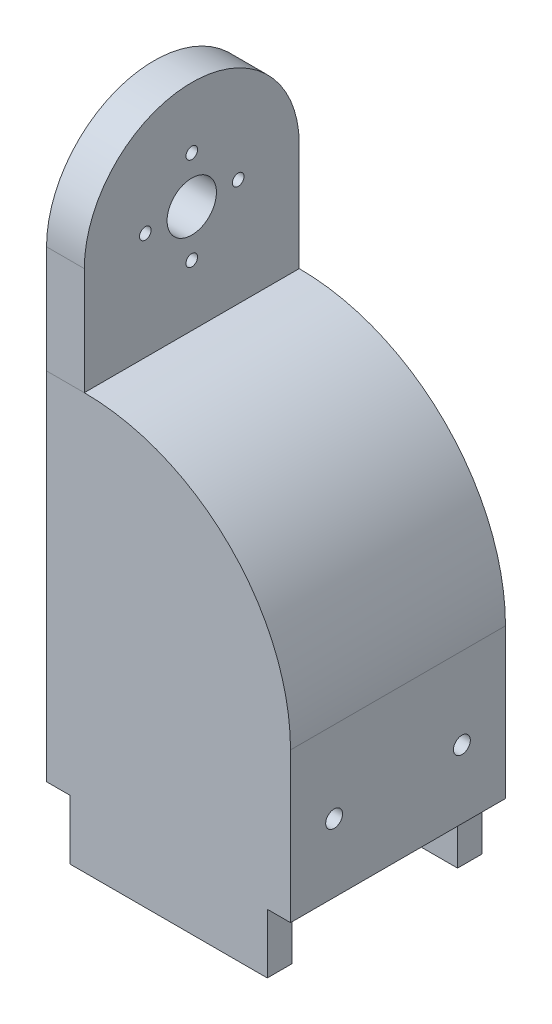
ISO-10303-21;
HEADER;
FILE_DESCRIPTION(('STEP AP214'),'2;1');
FILE_NAME('part.step','',(''),(''),'','','');
FILE_SCHEMA(('AUTOMOTIVE_DESIGN { 1 0 10303 214 1 1 1 1 }'));
ENDSEC;
DATA;
#1=APPLICATION_CONTEXT('core data for automotive mechanical design processes');
#2=APPLICATION_PROTOCOL_DEFINITION('international standard','automotive_design',2000,#1);
#3=PRODUCT_CONTEXT('',#1,'mechanical');
#4=PRODUCT('Part','Part','',(#3));
#5=PRODUCT_RELATED_PRODUCT_CATEGORY('part','',(#4));
#6=PRODUCT_DEFINITION_FORMATION('','',#4);
#7=PRODUCT_DEFINITION_CONTEXT('part definition',#1,'design');
#8=PRODUCT_DEFINITION('design','',#6,#7);
#9=PRODUCT_DEFINITION_SHAPE('','',#8);
#10=(LENGTH_UNIT() NAMED_UNIT(*) SI_UNIT(.MILLI.,.METRE.));
#11=(NAMED_UNIT(*) PLANE_ANGLE_UNIT() SI_UNIT($,.RADIAN.));
#12=(NAMED_UNIT(*) SI_UNIT($,.STERADIAN.) SOLID_ANGLE_UNIT());
#13=UNCERTAINTY_MEASURE_WITH_UNIT(LENGTH_MEASURE(1.E-05),#10,'distance_accuracy_value','');
#14=(GEOMETRIC_REPRESENTATION_CONTEXT(3) GLOBAL_UNCERTAINTY_ASSIGNED_CONTEXT((#13)) GLOBAL_UNIT_ASSIGNED_CONTEXT((#10,
#11,#12)) REPRESENTATION_CONTEXT('',''));
#15=CARTESIAN_POINT('',(0.,0.,0.));
#16=DIRECTION('',(0.,0.,1.));
#17=DIRECTION('',(1.,0.,0.));
#18=AXIS2_PLACEMENT_3D('',#15,#16,#17);
#19=CARTESIAN_POINT('',(7.77916234626263,147.70603748985,27.6424805889509));
#20=DIRECTION('',(1.,0.,0.));
#21=DIRECTION('',(0.,1.,0.));
#22=AXIS2_PLACEMENT_3D('',#19,#20,#21);
#23=PLANE('',#22);
#24=DIRECTION('',(0.,0.,1.));
#25=VECTOR('',#24,1.);
#26=CARTESIAN_POINT('',(7.77916234626261,2.95603748984996,27.6424805889509));
#27=LINE('',#26,#25);
#28=CARTESIAN_POINT('',(7.77916234626259,2.95603748984996,40.8924805889509));
#29=VERTEX_POINT('',#28);
#30=CARTESIAN_POINT('',(7.77916234626261,2.95603748984996,69.3924805889509));
#31=VERTEX_POINT('',#30);
#32=EDGE_CURVE('P0_E345',#29,#31,#27,.T.);
#33=ORIENTED_EDGE('',*,*,#32,.T.);
#34=DIRECTION('',(0.,1.,0.));
#35=VECTOR('',#34,1.);
#36=CARTESIAN_POINT('',(7.77916234626261,-22.0439625101501,69.3924805889509));
#37=LINE('',#36,#35);
#38=CARTESIAN_POINT('',(7.77916234626259,-12.0439625101501,69.3924805889509));
#39=VERTEX_POINT('',#38);
#40=EDGE_CURVE('P0_E351',#39,#31,#37,.T.);
#41=ORIENTED_EDGE('',*,*,#40,.F.);
#42=DIRECTION('',(0.,0.,1.));
#43=VECTOR('',#42,1.);
#44=CARTESIAN_POINT('',(7.77916234626259,-12.0439625101501,27.6424805889509));
#45=LINE('',#44,#43);
#46=CARTESIAN_POINT('',(7.77916234626259,-12.0439625101501,40.8924805889509));
#47=VERTEX_POINT('',#46);
#48=EDGE_CURVE('P0_E205',#47,#39,#45,.T.);
#49=ORIENTED_EDGE('',*,*,#48,.F.);
#50=DIRECTION('',(0.,1.,0.));
#51=VECTOR('',#50,1.);
#52=CARTESIAN_POINT('',(7.77916234626261,-22.0439625101501,40.8924805889509));
#53=LINE('',#52,#51);
#54=EDGE_CURVE('P0_E330',#47,#29,#53,.T.);
#55=ORIENTED_EDGE('',*,*,#54,.T.);
#56=EDGE_LOOP('',(#33,#41,#49,#55));
#57=FACE_BOUND('',#56,.T.);
#58=CARTESIAN_POINT('',(7.7791623462626,-0.293962510150042,66.1424805889509));
#59=DIRECTION('',(1.,0.,0.));
#60=DIRECTION('',(0.,0.,-1.));
#61=AXIS2_PLACEMENT_3D('',#58,#59,#60);
#62=CIRCLE('',#61,1.45);
#63=CARTESIAN_POINT('',(7.7791623462626,-0.293962510150042,64.6924805889509));
#64=VERTEX_POINT('',#63);
#65=EDGE_CURVE('P0_E289',#64,#64,#62,.T.);
#66=ORIENTED_EDGE('',*,*,#65,.F.);
#67=EDGE_LOOP('',(#66));
#68=FACE_BOUND('',#67,.T.);
#69=CARTESIAN_POINT('',(7.7791623462626,-0.293962510150042,44.1424805889509));
#70=DIRECTION('',(1.,0.,0.));
#71=DIRECTION('',(0.,0.,-1.));
#72=AXIS2_PLACEMENT_3D('',#69,#70,#71);
#73=CIRCLE('',#72,1.45);
#74=CARTESIAN_POINT('',(7.7791623462626,-0.293962510150042,42.6924805889509));
#75=VERTEX_POINT('',#74);
#76=EDGE_CURVE('P0_E296',#75,#75,#73,.T.);
#77=ORIENTED_EDGE('',*,*,#76,.F.);
#78=EDGE_LOOP('',(#77));
#79=FACE_BOUND('',#78,.T.);
#80=ADVANCED_FACE('P0_F45',(#57,#68,#79),#23,.T.);
#81=CARTESIAN_POINT('',(24.7791623462626,2.95603748984996,27.6424805889509));
#82=DIRECTION('',(0.,1.,0.));
#83=DIRECTION('',(0.,0.,1.));
#84=AXIS2_PLACEMENT_3D('',#81,#82,#83);
#85=PLANE('',#84);
#86=DIRECTION('',(-1.,0.,0.));
#87=VECTOR('',#86,1.);
#88=CARTESIAN_POINT('',(7.77916234626261,2.95603748984996,40.8924805889509));
#89=LINE('',#88,#87);
#90=CARTESIAN_POINT('',(41.7791623462626,2.95603748984996,40.8924805889509));
#91=VERTEX_POINT('',#90);
#92=EDGE_CURVE('P0_E196',#91,#29,#89,.T.);
#93=ORIENTED_EDGE('',*,*,#92,.F.);
#94=DIRECTION('',(0.,0.,1.));
#95=VECTOR('',#94,1.);
#96=CARTESIAN_POINT('',(41.7791623462626,2.95603748984996,27.6424805889509));
#97=LINE('',#96,#95);
#98=CARTESIAN_POINT('',(41.7791623462626,2.95603748984996,69.3924805889509));
#99=VERTEX_POINT('',#98);
#100=EDGE_CURVE('P0_E183',#91,#99,#97,.T.);
#101=ORIENTED_EDGE('',*,*,#100,.T.);
#102=DIRECTION('',(1.,0.,0.));
#103=VECTOR('',#102,1.);
#104=CARTESIAN_POINT('',(7.77916234626261,2.95603748984996,69.3924805889509));
#105=LINE('',#104,#103);
#106=EDGE_CURVE('P0_E285',#31,#99,#105,.T.);
#107=ORIENTED_EDGE('',*,*,#106,.F.);
#108=ORIENTED_EDGE('',*,*,#32,.F.);
#109=EDGE_LOOP('',(#93,#101,#107,#108));
#110=FACE_BOUND('',#109,.T.);
#111=ADVANCED_FACE('P0_F360',(#110),#85,.F.);
#112=CARTESIAN_POINT('',(41.7791623462626,147.70603748985,27.6424805889509));
#113=DIRECTION('',(1.,0.,0.));
#114=DIRECTION('',(0.,0.,-1.));
#115=AXIS2_PLACEMENT_3D('',#112,#113,#114);
#116=PLANE('',#115);
#117=DIRECTION('',(0.,1.,0.));
#118=VECTOR('',#117,1.);
#119=CARTESIAN_POINT('',(41.7791623462626,-22.0439625101501,69.3924805889509));
#120=LINE('',#119,#118);
#121=CARTESIAN_POINT('',(41.7791623462626,-12.0439625101501,69.3924805889509));
#122=VERTEX_POINT('',#121);
#123=EDGE_CURVE('P0_E178',#122,#99,#120,.T.);
#124=ORIENTED_EDGE('',*,*,#123,.T.);
#125=ORIENTED_EDGE('',*,*,#100,.F.);
#126=DIRECTION('',(0.,1.,0.));
#127=VECTOR('',#126,1.);
#128=CARTESIAN_POINT('',(41.7791623462626,-22.0439625101501,40.8924805889509));
#129=LINE('',#128,#127);
#130=CARTESIAN_POINT('',(41.7791623462626,-12.0439625101501,40.8924805889509));
#131=VERTEX_POINT('',#130);
#132=EDGE_CURVE('P0_E180',#131,#91,#129,.T.);
#133=ORIENTED_EDGE('',*,*,#132,.F.);
#134=DIRECTION('',(0.,0.,1.));
#135=VECTOR('',#134,1.);
#136=CARTESIAN_POINT('',(41.7791623462626,-12.0439625101501,27.6424805889509));
#137=LINE('',#136,#135);
#138=EDGE_CURVE('P0_E165',#131,#122,#137,.T.);
#139=ORIENTED_EDGE('',*,*,#138,.T.);
#140=EDGE_LOOP('',(#124,#125,#133,#139));
#141=FACE_BOUND('',#140,.T.);
#142=CARTESIAN_POINT('',(41.7791623462626,-0.293962510150042,66.1424805889509));
#143=DIRECTION('',(1.,0.,0.));
#144=DIRECTION('',(0.,0.,-1.));
#145=AXIS2_PLACEMENT_3D('',#142,#143,#144);
#146=CIRCLE('',#145,1.45);
#147=CARTESIAN_POINT('',(41.7791623462626,-0.293962510150042,64.6924805889509));
#148=VERTEX_POINT('',#147);
#149=EDGE_CURVE('P0_E177',#148,#148,#146,.T.);
#150=ORIENTED_EDGE('',*,*,#149,.T.);
#151=EDGE_LOOP('',(#150));
#152=FACE_BOUND('',#151,.T.);
#153=CARTESIAN_POINT('',(41.7791623462626,-0.293962510150042,44.1424805889509));
#154=DIRECTION('',(1.,0.,0.));
#155=DIRECTION('',(0.,0.,-1.));
#156=AXIS2_PLACEMENT_3D('',#153,#154,#155);
#157=CIRCLE('',#156,1.45);
#158=CARTESIAN_POINT('',(41.7791623462626,-0.293962510150042,42.6924805889509));
#159=VERTEX_POINT('',#158);
#160=EDGE_CURVE('P0_E281',#159,#159,#157,.T.);
#161=ORIENTED_EDGE('',*,*,#160,.T.);
#162=EDGE_LOOP('',(#161));
#163=FACE_BOUND('',#162,.T.);
#164=ADVANCED_FACE('P0_F181',(#141,#152,#163),#116,.F.);
#165=CARTESIAN_POINT('',(7.77916234626261,-22.0439625101501,69.3924805889509));
#166=DIRECTION('',(0.,0.,1.));
#167=DIRECTION('',(1.,0.,0.));
#168=AXIS2_PLACEMENT_3D('',#165,#166,#167);
#169=PLANE('',#168);
#170=ORIENTED_EDGE('',*,*,#106,.T.);
#171=ORIENTED_EDGE('',*,*,#123,.F.);
#172=CARTESIAN_POINT('',(41.7791623462626,-22.2939625101501,69.3924805889509));
#173=VERTEX_POINT('',#172);
#174=EDGE_CURVE('P0_E188',#173,#122,#120,.T.);
#175=ORIENTED_EDGE('',*,*,#174,.F.);
#176=DIRECTION('',(1.,0.,0.));
#177=VECTOR('',#176,1.);
#178=CARTESIAN_POINT('',(24.7791623462626,-22.2939625101501,69.3924805889509));
#179=LINE('',#178,#177);
#180=CARTESIAN_POINT('',(7.77916234626259,-22.2939625101501,69.3924805889509));
#181=VERTEX_POINT('',#180);
#182=EDGE_CURVE('P0_E217',#181,#173,#179,.T.);
#183=ORIENTED_EDGE('',*,*,#182,.F.);
#184=EDGE_CURVE('P0_E348',#181,#39,#37,.T.);
#185=ORIENTED_EDGE('',*,*,#184,.T.);
#186=ORIENTED_EDGE('',*,*,#40,.T.);
#187=EDGE_LOOP('',(#170,#171,#175,#183,#185,#186));
#188=FACE_BOUND('',#187,.T.);
#189=ADVANCED_FACE('P0_F365',(#188),#169,.F.);
#190=CARTESIAN_POINT('',(7.77916234626261,-22.0439625101501,40.8924805889509));
#191=DIRECTION('',(0.,0.,-1.));
#192=DIRECTION('',(-1.,0.,0.));
#193=AXIS2_PLACEMENT_3D('',#190,#191,#192);
#194=PLANE('',#193);
#195=ORIENTED_EDGE('',*,*,#92,.T.);
#196=ORIENTED_EDGE('',*,*,#54,.F.);
#197=CARTESIAN_POINT('',(7.77916234626259,-22.2939625101501,40.8924805889509));
#198=VERTEX_POINT('',#197);
#199=EDGE_CURVE('P0_E199',#198,#47,#53,.T.);
#200=ORIENTED_EDGE('',*,*,#199,.F.);
#201=DIRECTION('',(1.,0.,0.));
#202=VECTOR('',#201,1.);
#203=CARTESIAN_POINT('',(24.7791623462626,-22.2939625101501,40.8924805889509));
#204=LINE('',#203,#202);
#205=CARTESIAN_POINT('',(41.7791623462626,-22.2939625101501,40.8924805889509));
#206=VERTEX_POINT('',#205);
#207=EDGE_CURVE('P0_E192',#198,#206,#204,.T.);
#208=ORIENTED_EDGE('',*,*,#207,.T.);
#209=EDGE_CURVE('P0_E156',#206,#131,#129,.T.);
#210=ORIENTED_EDGE('',*,*,#209,.T.);
#211=ORIENTED_EDGE('',*,*,#132,.T.);
#212=EDGE_LOOP('',(#195,#196,#200,#208,#210,#211));
#213=FACE_BOUND('',#212,.T.);
#214=ADVANCED_FACE('P0_F190',(#213),#194,.F.);
#215=CARTESIAN_POINT('',(41.7791623462626,147.70603748985,82.6424805889509));
#216=DIRECTION('',(1.,0.,0.));
#217=DIRECTION('',(0.,1.,0.));
#218=AXIS2_PLACEMENT_3D('',#215,#216,#217);
#219=PLANE('',#218);
#220=DIRECTION('',(0.,1.,0.));
#221=VECTOR('',#220,1.);
#222=CARTESIAN_POINT('',(41.7791623462626,147.70603748985,73.6424805889509));
#223=LINE('',#222,#221);
#224=CARTESIAN_POINT('',(41.7791623462626,-22.2939625101501,73.6424805889509));
#225=VERTEX_POINT('',#224);
#226=CARTESIAN_POINT('',(41.7791623462626,-12.0439625101501,73.6424805889509));
#227=VERTEX_POINT('',#226);
#228=EDGE_CURVE('P0_E237',#225,#227,#223,.T.);
#229=ORIENTED_EDGE('',*,*,#228,.F.);
#230=DIRECTION('',(0.,0.,1.));
#231=VECTOR('',#230,1.);
#232=CARTESIAN_POINT('',(41.7791623462626,-22.2939625101501,69.3924805889509));
#233=LINE('',#232,#231);
#234=EDGE_CURVE('P0_E212',#173,#225,#233,.T.);
#235=ORIENTED_EDGE('',*,*,#234,.F.);
#236=ORIENTED_EDGE('',*,*,#174,.T.);
#237=EDGE_CURVE('P0_E163',#122,#227,#137,.T.);
#238=ORIENTED_EDGE('',*,*,#237,.T.);
#239=EDGE_LOOP('',(#229,#235,#236,#238));
#240=FACE_BOUND('',#239,.T.);
#241=ADVANCED_FACE('P0_F372',(#240),#219,.T.);
#242=DIRECTION('',(0.,-1.,0.));
#243=VECTOR('',#242,1.);
#244=CARTESIAN_POINT('',(41.7791623462626,147.70603748985,36.6424805889509));
#245=LINE('',#244,#243);
#246=CARTESIAN_POINT('',(41.7791623462626,-12.0439625101501,36.6424805889509));
#247=VERTEX_POINT('',#246);
#248=CARTESIAN_POINT('',(41.7791623462626,-22.2939625101501,36.6424805889509));
#249=VERTEX_POINT('',#248);
#250=EDGE_CURVE('P0_E158',#247,#249,#245,.T.);
#251=ORIENTED_EDGE('',*,*,#250,.F.);
#252=EDGE_CURVE('P0_E151',#247,#131,#137,.T.);
#253=ORIENTED_EDGE('',*,*,#252,.T.);
#254=ORIENTED_EDGE('',*,*,#209,.F.);
#255=DIRECTION('',(0.,0.,-1.));
#256=VECTOR('',#255,1.);
#257=CARTESIAN_POINT('',(41.7791623462626,-22.2939625101501,40.8924805889509));
#258=LINE('',#257,#256);
#259=EDGE_CURVE('P0_E162',#206,#249,#258,.T.);
#260=ORIENTED_EDGE('',*,*,#259,.T.);
#261=EDGE_LOOP('',(#251,#253,#254,#260));
#262=FACE_BOUND('',#261,.T.);
#263=ADVANCED_FACE('P0_F153',(#262),#219,.T.);
#264=CARTESIAN_POINT('',(41.7791623462626,-12.0439625101501,27.6424805889509));
#265=DIRECTION('',(0.,1.,0.));
#266=DIRECTION('',(-1.,0.,0.));
#267=AXIS2_PLACEMENT_3D('',#264,#265,#266);
#268=PLANE('',#267);
#269=DIRECTION('',(0.,0.,1.));
#270=VECTOR('',#269,1.);
#271=CARTESIAN_POINT('',(45.7791623462626,-12.0439625101501,27.6424805889509));
#272=LINE('',#271,#270);
#273=CARTESIAN_POINT('',(45.7791623462626,-12.0439625101501,36.6424805889509));
#274=VERTEX_POINT('',#273);
#275=CARTESIAN_POINT('',(45.7791623462626,-12.0439625101501,73.6424805889509));
#276=VERTEX_POINT('',#275);
#277=EDGE_CURVE('P0_E223',#274,#276,#272,.T.);
#278=ORIENTED_EDGE('',*,*,#277,.T.);
#279=DIRECTION('',(-1.,0.,0.));
#280=VECTOR('',#279,1.);
#281=CARTESIAN_POINT('',(41.7791623462626,-12.0439625101501,73.6424805889509));
#282=LINE('',#281,#280);
#283=EDGE_CURVE('P0_E230',#276,#227,#282,.T.);
#284=ORIENTED_EDGE('',*,*,#283,.T.);
#285=ORIENTED_EDGE('',*,*,#237,.F.);
#286=ORIENTED_EDGE('',*,*,#138,.F.);
#287=ORIENTED_EDGE('',*,*,#252,.F.);
#288=DIRECTION('',(1.,0.,0.));
#289=VECTOR('',#288,1.);
#290=CARTESIAN_POINT('',(41.7791623462626,-12.0439625101501,36.6424805889509));
#291=LINE('',#290,#289);
#292=EDGE_CURVE('P0_E211',#247,#274,#291,.T.);
#293=ORIENTED_EDGE('',*,*,#292,.T.);
#294=EDGE_LOOP('',(#278,#284,#285,#286,#287,#293));
#295=FACE_BOUND('',#294,.T.);
#296=ADVANCED_FACE('P0_F170',(#295),#268,.F.);
#297=CARTESIAN_POINT('',(7.77916234626265,147.70603748985,82.6424805889509));
#298=DIRECTION('',(-1.,0.,0.));
#299=DIRECTION('',(0.,1.,0.));
#300=AXIS2_PLACEMENT_3D('',#297,#298,#299);
#301=PLANE('',#300);
#302=DIRECTION('',(0.,-1.,0.));
#303=VECTOR('',#302,1.);
#304=CARTESIAN_POINT('',(7.77916234626265,147.70603748985,73.6424805889509));
#305=LINE('',#304,#303);
#306=CARTESIAN_POINT('',(7.77916234626259,-12.0439625101501,73.6424805889509));
#307=VERTEX_POINT('',#306);
#308=CARTESIAN_POINT('',(7.77916234626259,-22.2939625101501,73.6424805889509));
#309=VERTEX_POINT('',#308);
#310=EDGE_CURVE('P0_E244',#307,#309,#305,.T.);
#311=ORIENTED_EDGE('',*,*,#310,.F.);
#312=EDGE_CURVE('P0_E206',#39,#307,#45,.T.);
#313=ORIENTED_EDGE('',*,*,#312,.F.);
#314=ORIENTED_EDGE('',*,*,#184,.F.);
#315=DIRECTION('',(0.,0.,1.));
#316=VECTOR('',#315,1.);
#317=CARTESIAN_POINT('',(7.77916234626259,-22.2939625101501,69.3924805889509));
#318=LINE('',#317,#316);
#319=EDGE_CURVE('P0_E207',#181,#309,#318,.T.);
#320=ORIENTED_EDGE('',*,*,#319,.T.);
#321=EDGE_LOOP('',(#311,#313,#314,#320));
#322=FACE_BOUND('',#321,.T.);
#323=ADVANCED_FACE('P0_F408',(#322),#301,.T.);
#324=DIRECTION('',(0.,1.,0.));
#325=VECTOR('',#324,1.);
#326=CARTESIAN_POINT('',(7.77916234626265,147.70603748985,36.6424805889509));
#327=LINE('',#326,#325);
#328=CARTESIAN_POINT('',(7.77916234626259,-22.2939625101501,36.6424805889509));
#329=VERTEX_POINT('',#328);
#330=CARTESIAN_POINT('',(7.77916234626259,-12.0439625101501,36.6424805889509));
#331=VERTEX_POINT('',#330);
#332=EDGE_CURVE('P0_E256',#329,#331,#327,.T.);
#333=ORIENTED_EDGE('',*,*,#332,.F.);
#334=DIRECTION('',(0.,0.,-1.));
#335=VECTOR('',#334,1.);
#336=CARTESIAN_POINT('',(7.77916234626259,-22.2939625101501,40.8924805889509));
#337=LINE('',#336,#335);
#338=EDGE_CURVE('P0_E216',#198,#329,#337,.T.);
#339=ORIENTED_EDGE('',*,*,#338,.F.);
#340=ORIENTED_EDGE('',*,*,#199,.T.);
#341=EDGE_CURVE('P0_E202',#331,#47,#45,.T.);
#342=ORIENTED_EDGE('',*,*,#341,.F.);
#343=EDGE_LOOP('',(#333,#339,#340,#342));
#344=FACE_BOUND('',#343,.T.);
#345=ADVANCED_FACE('P0_F427',(#344),#301,.T.);
#346=CARTESIAN_POINT('',(7.77916234626259,-12.0439625101501,27.6424805889509));
#347=DIRECTION('',(0.,-1.,0.));
#348=DIRECTION('',(1.,0.,0.));
#349=AXIS2_PLACEMENT_3D('',#346,#347,#348);
#350=PLANE('',#349);
#351=DIRECTION('',(1.,0.,0.));
#352=VECTOR('',#351,1.);
#353=CARTESIAN_POINT('',(7.77916234626259,-12.0439625101501,73.6424805889509));
#354=LINE('',#353,#352);
#355=CARTESIAN_POINT('',(3.7791623462626,-12.0439625101501,73.6424805889509));
#356=VERTEX_POINT('',#355);
#357=EDGE_CURVE('P0_E247',#356,#307,#354,.T.);
#358=ORIENTED_EDGE('',*,*,#357,.F.);
#359=DIRECTION('',(0.,0.,1.));
#360=VECTOR('',#359,1.);
#361=CARTESIAN_POINT('',(3.7791623462626,-12.0439625101501,27.6424805889509));
#362=LINE('',#361,#360);
#363=CARTESIAN_POINT('',(3.7791623462626,-12.0439625101501,36.6424805889509));
#364=VERTEX_POINT('',#363);
#365=EDGE_CURVE('P0_E231',#364,#356,#362,.T.);
#366=ORIENTED_EDGE('',*,*,#365,.F.);
#367=DIRECTION('',(-1.,0.,0.));
#368=VECTOR('',#367,1.);
#369=CARTESIAN_POINT('',(7.77916234626259,-12.0439625101501,36.6424805889509));
#370=LINE('',#369,#368);
#371=EDGE_CURVE('P0_E259',#331,#364,#370,.T.);
#372=ORIENTED_EDGE('',*,*,#371,.F.);
#373=ORIENTED_EDGE('',*,*,#341,.T.);
#374=ORIENTED_EDGE('',*,*,#48,.T.);
#375=ORIENTED_EDGE('',*,*,#312,.T.);
#376=EDGE_LOOP('',(#358,#366,#372,#373,#374,#375));
#377=FACE_BOUND('',#376,.T.);
#378=ADVANCED_FACE('P0_F422',(#377),#350,.T.);
#379=CARTESIAN_POINT('',(24.7791623462626,-22.2939625101501,69.3924805889509));
#380=DIRECTION('',(0.,-1.,0.));
#381=DIRECTION('',(0.,0.,-1.));
#382=AXIS2_PLACEMENT_3D('',#379,#380,#381);
#383=PLANE('',#382);
#384=DIRECTION('',(1.,0.,0.));
#385=VECTOR('',#384,1.);
#386=CARTESIAN_POINT('',(3.7791623462626,-22.2939625101501,73.6424805889509));
#387=LINE('',#386,#385);
#388=EDGE_CURVE('P0_E241',#309,#225,#387,.T.);
#389=ORIENTED_EDGE('',*,*,#388,.F.);
#390=ORIENTED_EDGE('',*,*,#319,.F.);
#391=ORIENTED_EDGE('',*,*,#182,.T.);
#392=ORIENTED_EDGE('',*,*,#234,.T.);
#393=EDGE_LOOP('',(#389,#390,#391,#392));
#394=FACE_BOUND('',#393,.T.);
#395=ADVANCED_FACE('P0_F426',(#394),#383,.T.);
#396=CARTESIAN_POINT('',(24.7791623462626,-22.2939625101501,40.8924805889509));
#397=DIRECTION('',(0.,1.,0.));
#398=DIRECTION('',(0.,0.,1.));
#399=AXIS2_PLACEMENT_3D('',#396,#397,#398);
#400=PLANE('',#399);
#401=ORIENTED_EDGE('',*,*,#338,.T.);
#402=DIRECTION('',(-1.,0.,0.));
#403=VECTOR('',#402,1.);
#404=CARTESIAN_POINT('',(45.7791623462626,-22.2939625101501,36.6424805889509));
#405=LINE('',#404,#403);
#406=EDGE_CURVE('P0_E252',#249,#329,#405,.T.);
#407=ORIENTED_EDGE('',*,*,#406,.F.);
#408=ORIENTED_EDGE('',*,*,#259,.F.);
#409=ORIENTED_EDGE('',*,*,#207,.F.);
#410=EDGE_LOOP('',(#401,#407,#408,#409));
#411=FACE_BOUND('',#410,.T.);
#412=ADVANCED_FACE('P0_F552',(#411),#400,.F.);
#413=CARTESIAN_POINT('',(-0.220837653737413,147.70603748985,73.6424805889509));
#414=DIRECTION('',(0.,0.,1.));
#415=DIRECTION('',(1.,0.,0.));
#416=AXIS2_PLACEMENT_3D('',#413,#414,#415);
#417=PLANE('',#416);
#418=DIRECTION('',(0.,-1.,0.));
#419=VECTOR('',#418,1.);
#420=CARTESIAN_POINT('',(45.7791623462626,141.20603748985,73.6424805889509));
#421=LINE('',#420,#419);
#422=CARTESIAN_POINT('',(45.7791623462626,13.7060374898499,73.6424805889509));
#423=VERTEX_POINT('',#422);
#424=EDGE_CURVE('P0_E267',#423,#276,#421,.T.);
#425=ORIENTED_EDGE('',*,*,#424,.F.);
#426=CARTESIAN_POINT('',(10.2791623462626,13.7060374898499,73.6424805889509));
#427=DIRECTION('',(0.,0.,1.));
#428=DIRECTION('',(1.,0.,0.));
#429=AXIS2_PLACEMENT_3D('',#426,#427,#428);
#430=CIRCLE('',#429,35.5);
#431=CARTESIAN_POINT('',(10.2791623462626,49.2060374898499,73.6424805889509));
#432=VERTEX_POINT('',#431);
#433=EDGE_CURVE('P0_E68',#423,#432,#430,.T.);
#434=ORIENTED_EDGE('',*,*,#433,.T.);
#435=DIRECTION('',(-1.,0.,0.));
#436=VECTOR('',#435,1.);
#437=CARTESIAN_POINT('',(45.7791623462626,49.2060374898499,73.6424805889509));
#438=LINE('',#437,#436);
#439=CARTESIAN_POINT('',(3.7791623462626,49.2060374898499,73.6424805889509));
#440=VERTEX_POINT('',#439);
#441=EDGE_CURVE('P0_E226',#432,#440,#438,.T.);
#442=ORIENTED_EDGE('',*,*,#441,.T.);
#443=DIRECTION('',(0.,1.,0.));
#444=VECTOR('',#443,1.);
#445=CARTESIAN_POINT('',(3.7791623462626,147.70603748985,73.6424805889509));
#446=LINE('',#445,#444);
#447=EDGE_CURVE('P0_E236',#356,#440,#446,.T.);
#448=ORIENTED_EDGE('',*,*,#447,.F.);
#449=ORIENTED_EDGE('',*,*,#357,.T.);
#450=ORIENTED_EDGE('',*,*,#310,.T.);
#451=ORIENTED_EDGE('',*,*,#388,.T.);
#452=ORIENTED_EDGE('',*,*,#228,.T.);
#453=ORIENTED_EDGE('',*,*,#283,.F.);
#454=EDGE_LOOP('',(#425,#434,#442,#448,#449,#450,#451,#452,#453));
#455=FACE_BOUND('',#454,.T.);
#456=ADVANCED_FACE('P0_F457',(#455),#417,.T.);
#457=CARTESIAN_POINT('',(-0.220837653737413,147.70603748985,36.6424805889509));
#458=DIRECTION('',(0.,0.,1.));
#459=DIRECTION('',(1.,0.,0.));
#460=AXIS2_PLACEMENT_3D('',#457,#458,#459);
#461=PLANE('',#460);
#462=DIRECTION('',(-1.,0.,0.));
#463=VECTOR('',#462,1.);
#464=CARTESIAN_POINT('',(45.7791623462626,49.2060374898499,36.6424805889509));
#465=LINE('',#464,#463);
#466=CARTESIAN_POINT('',(10.2791623462626,49.2060374898499,36.6424805889509));
#467=VERTEX_POINT('',#466);
#468=CARTESIAN_POINT('',(3.7791623462626,49.2060374898499,36.6424805889509));
#469=VERTEX_POINT('',#468);
#470=EDGE_CURVE('P0_E304',#467,#469,#465,.T.);
#471=ORIENTED_EDGE('',*,*,#470,.F.);
#472=CARTESIAN_POINT('',(10.2791623462626,13.7060374898499,36.6424805889509));
#473=DIRECTION('',(0.,0.,1.));
#474=DIRECTION('',(1.,0.,0.));
#475=AXIS2_PLACEMENT_3D('',#472,#473,#474);
#476=CIRCLE('',#475,35.5);
#477=CARTESIAN_POINT('',(45.7791623462626,13.7060374898499,36.6424805889509));
#478=VERTEX_POINT('',#477);
#479=EDGE_CURVE('P0_E11',#467,#478,#476,.F.);
#480=ORIENTED_EDGE('',*,*,#479,.T.);
#481=DIRECTION('',(0.,-1.,0.));
#482=VECTOR('',#481,1.);
#483=CARTESIAN_POINT('',(45.7791623462626,141.20603748985,36.6424805889509));
#484=LINE('',#483,#482);
#485=EDGE_CURVE('P0_E253',#478,#274,#484,.T.);
#486=ORIENTED_EDGE('',*,*,#485,.T.);
#487=ORIENTED_EDGE('',*,*,#292,.F.);
#488=ORIENTED_EDGE('',*,*,#250,.T.);
#489=ORIENTED_EDGE('',*,*,#406,.T.);
#490=ORIENTED_EDGE('',*,*,#332,.T.);
#491=ORIENTED_EDGE('',*,*,#371,.T.);
#492=DIRECTION('',(0.,1.,0.));
#493=VECTOR('',#492,1.);
#494=CARTESIAN_POINT('',(3.7791623462626,147.70603748985,36.6424805889509));
#495=LINE('',#494,#493);
#496=EDGE_CURVE('P0_E240',#364,#469,#495,.T.);
#497=ORIENTED_EDGE('',*,*,#496,.T.);
#498=EDGE_LOOP('',(#471,#480,#486,#487,#488,#489,#490,#491,#497));
#499=FACE_BOUND('',#498,.T.);
#500=ADVANCED_FACE('P0_F451',(#499),#461,.F.);
#501=CARTESIAN_POINT('',(3.7791623462626,-12.0439625101501,27.6424805889509));
#502=DIRECTION('',(1.,0.,0.));
#503=DIRECTION('',(0.,0.,-1.));
#504=AXIS2_PLACEMENT_3D('',#501,#502,#503);
#505=PLANE('',#504);
#506=ORIENTED_EDGE('',*,*,#447,.T.);
#507=DIRECTION('',(0.,0.,1.));
#508=VECTOR('',#507,1.);
#509=CARTESIAN_POINT('',(3.7791623462626,49.2060374898499,36.6424805889509));
#510=LINE('',#509,#508);
#511=EDGE_CURVE('P0_E303',#469,#440,#510,.T.);
#512=ORIENTED_EDGE('',*,*,#511,.F.);
#513=ORIENTED_EDGE('',*,*,#496,.F.);
#514=ORIENTED_EDGE('',*,*,#365,.T.);
#515=EDGE_LOOP('',(#506,#512,#513,#514));
#516=FACE_BOUND('',#515,.T.);
#517=CARTESIAN_POINT('',(3.7791623462626,-0.293962510150042,66.1424805889509));
#518=DIRECTION('',(1.,0.,0.));
#519=DIRECTION('',(0.,0.,-1.));
#520=AXIS2_PLACEMENT_3D('',#517,#518,#519);
#521=CIRCLE('',#520,1.45);
#522=CARTESIAN_POINT('',(3.7791623462626,-0.293962510150042,64.6924805889509));
#523=VERTEX_POINT('',#522);
#524=EDGE_CURVE('P0_E235',#523,#523,#521,.T.);
#525=ORIENTED_EDGE('',*,*,#524,.T.);
#526=EDGE_LOOP('',(#525));
#527=FACE_BOUND('',#526,.T.);
#528=CARTESIAN_POINT('',(3.7791623462626,-0.293962510150042,44.1424805889509));
#529=DIRECTION('',(1.,0.,0.));
#530=DIRECTION('',(0.,0.,-1.));
#531=AXIS2_PLACEMENT_3D('',#528,#529,#530);
#532=CIRCLE('',#531,1.45);
#533=CARTESIAN_POINT('',(3.7791623462626,-0.293962510150042,42.6924805889509));
#534=VERTEX_POINT('',#533);
#535=EDGE_CURVE('P0_E271',#534,#534,#532,.T.);
#536=ORIENTED_EDGE('',*,*,#535,.T.);
#537=EDGE_LOOP('',(#536));
#538=FACE_BOUND('',#537,.T.);
#539=ADVANCED_FACE('P0_F456',(#516,#527,#538),#505,.F.);
#540=CARTESIAN_POINT('',(45.7791623462626,-12.0439625101501,27.6424805889509));
#541=DIRECTION('',(-1.,0.,0.));
#542=DIRECTION('',(0.,0.,1.));
#543=AXIS2_PLACEMENT_3D('',#540,#541,#542);
#544=PLANE('',#543);
#545=ORIENTED_EDGE('',*,*,#485,.F.);
#546=DIRECTION('',(0.,0.,1.));
#547=VECTOR('',#546,1.);
#548=CARTESIAN_POINT('',(45.7791623462626,13.7060374898499,27.6424805889509));
#549=LINE('',#548,#547);
#550=EDGE_CURVE('P0_E307',#478,#423,#549,.T.);
#551=ORIENTED_EDGE('',*,*,#550,.T.);
#552=ORIENTED_EDGE('',*,*,#424,.T.);
#553=ORIENTED_EDGE('',*,*,#277,.F.);
#554=EDGE_LOOP('',(#545,#551,#552,#553));
#555=FACE_BOUND('',#554,.T.);
#556=CARTESIAN_POINT('',(45.7791623462626,-0.293962510150042,66.1424805889509));
#557=DIRECTION('',(1.,0.,0.));
#558=DIRECTION('',(0.,0.,-1.));
#559=AXIS2_PLACEMENT_3D('',#556,#557,#558);
#560=CIRCLE('',#559,1.45);
#561=CARTESIAN_POINT('',(45.7791623462626,-0.293962510150042,64.6924805889509));
#562=VERTEX_POINT('',#561);
#563=EDGE_CURVE('P0_E270',#562,#562,#560,.T.);
#564=ORIENTED_EDGE('',*,*,#563,.F.);
#565=EDGE_LOOP('',(#564));
#566=FACE_BOUND('',#565,.T.);
#567=CARTESIAN_POINT('',(45.7791623462626,-0.293962510150042,44.1424805889509));
#568=DIRECTION('',(1.,0.,0.));
#569=DIRECTION('',(0.,0.,-1.));
#570=AXIS2_PLACEMENT_3D('',#567,#568,#569);
#571=CIRCLE('',#570,1.45);
#572=CARTESIAN_POINT('',(45.7791623462626,-0.293962510150042,42.6924805889509));
#573=VERTEX_POINT('',#572);
#574=EDGE_CURVE('P0_E277',#573,#573,#571,.T.);
#575=ORIENTED_EDGE('',*,*,#574,.F.);
#576=EDGE_LOOP('',(#575));
#577=FACE_BOUND('',#576,.T.);
#578=ADVANCED_FACE('P0_F465',(#555,#566,#577),#544,.F.);
#579=CARTESIAN_POINT('',(41.7791623462626,-0.293962510150042,66.1424805889509));
#580=DIRECTION('',(1.,0.,0.));
#581=DIRECTION('',(0.,0.,-1.));
#582=AXIS2_PLACEMENT_3D('',#579,#580,#581);
#583=CYLINDRICAL_SURFACE('',#582,1.45);
#584=ORIENTED_EDGE('',*,*,#149,.F.);
#585=EDGE_LOOP('',(#584));
#586=FACE_BOUND('',#585,.T.);
#587=ORIENTED_EDGE('',*,*,#563,.T.);
#588=EDGE_LOOP('',(#587));
#589=FACE_BOUND('',#588,.T.);
#590=ADVANCED_FACE('P0_F476',(#586,#589),#583,.F.);
#591=CARTESIAN_POINT('',(41.7791623462626,-0.293962510150042,44.1424805889509));
#592=DIRECTION('',(1.,0.,0.));
#593=DIRECTION('',(0.,0.,-1.));
#594=AXIS2_PLACEMENT_3D('',#591,#592,#593);
#595=CYLINDRICAL_SURFACE('',#594,1.45);
#596=ORIENTED_EDGE('',*,*,#160,.F.);
#597=EDGE_LOOP('',(#596));
#598=FACE_BOUND('',#597,.T.);
#599=ORIENTED_EDGE('',*,*,#574,.T.);
#600=EDGE_LOOP('',(#599));
#601=FACE_BOUND('',#600,.T.);
#602=ADVANCED_FACE('P0_F484',(#598,#601),#595,.F.);
#603=CARTESIAN_POINT('',(7.7791623462626,-0.293962510150042,66.1424805889509));
#604=DIRECTION('',(-1.,0.,0.));
#605=DIRECTION('',(0.,0.,1.));
#606=AXIS2_PLACEMENT_3D('',#603,#604,#605);
#607=CYLINDRICAL_SURFACE('',#606,1.45);
#608=ORIENTED_EDGE('',*,*,#65,.T.);
#609=EDGE_LOOP('',(#608));
#610=FACE_BOUND('',#609,.T.);
#611=ORIENTED_EDGE('',*,*,#524,.F.);
#612=EDGE_LOOP('',(#611));
#613=FACE_BOUND('',#612,.T.);
#614=ADVANCED_FACE('P0_F494',(#610,#613),#607,.F.);
#615=CARTESIAN_POINT('',(7.7791623462626,-0.293962510150042,44.1424805889509));
#616=DIRECTION('',(-1.,0.,0.));
#617=DIRECTION('',(0.,0.,1.));
#618=AXIS2_PLACEMENT_3D('',#615,#616,#617);
#619=CYLINDRICAL_SURFACE('',#618,1.45);
#620=ORIENTED_EDGE('',*,*,#76,.T.);
#621=EDGE_LOOP('',(#620));
#622=FACE_BOUND('',#621,.T.);
#623=ORIENTED_EDGE('',*,*,#535,.F.);
#624=EDGE_LOOP('',(#623));
#625=FACE_BOUND('',#624,.T.);
#626=ADVANCED_FACE('P0_F504',(#622,#625),#619,.F.);
#627=CARTESIAN_POINT('',(45.7791623462626,49.2060374898499,36.6424805889509));
#628=DIRECTION('',(0.,-1.,0.));
#629=DIRECTION('',(0.,0.,-1.));
#630=AXIS2_PLACEMENT_3D('',#627,#628,#629);
#631=PLANE('',#630);
#632=ORIENTED_EDGE('',*,*,#441,.F.);
#633=DIRECTION('',(0.,0.,1.));
#634=VECTOR('',#633,1.);
#635=CARTESIAN_POINT('',(10.2791623462626,49.2060374898499,36.6424805889509));
#636=LINE('',#635,#634);
#637=EDGE_CURVE('P0_E54',#432,#467,#636,.F.);
#638=ORIENTED_EDGE('',*,*,#637,.T.);
#639=ORIENTED_EDGE('',*,*,#470,.T.);
#640=ORIENTED_EDGE('',*,*,#511,.T.);
#641=EDGE_LOOP('',(#632,#638,#639,#640));
#642=FACE_BOUND('',#641,.T.);
#643=ADVANCED_FACE('P0_F514',(#642),#631,.F.);
#644=CARTESIAN_POINT('',(10.2791623462626,13.7060374898499,27.6424805889509));
#645=DIRECTION('',(0.,0.,1.));
#646=DIRECTION('',(1.,0.,0.));
#647=AXIS2_PLACEMENT_3D('',#644,#645,#646);
#648=CYLINDRICAL_SURFACE('',#647,35.5);
#649=ORIENTED_EDGE('',*,*,#479,.F.);
#650=ORIENTED_EDGE('',*,*,#637,.F.);
#651=ORIENTED_EDGE('',*,*,#433,.F.);
#652=ORIENTED_EDGE('',*,*,#550,.F.);
#653=EDGE_LOOP('',(#649,#650,#651,#652));
#654=FACE_BOUND('',#653,.T.);
#655=ADVANCED_FACE('P0_F47',(#654),#648,.T.);
#656=CLOSED_SHELL('',(#80,#111,#164,#189,#214,#241,#263,#296,#323,#345,#378,#395,#412,#456,#500,
#539,#578,#590,#602,#614,#626,#643,#655));
#657=MANIFOLD_SOLID_BREP('P0_B2',#656);
#658=CARTESIAN_POINT('',(-5.22083765373738,75.7060374898499,55.1424805889509));
#659=DIRECTION('',(1.,0.,0.));
#660=DIRECTION('',(0.,1.,0.));
#661=AXIS2_PLACEMENT_3D('',#658,#659,#660);
#662=CYLINDRICAL_SURFACE('',#661,1.);
#663=CARTESIAN_POINT('',(3.77916234626259,75.7060374898499,55.1424805889509));
#664=DIRECTION('',(1.,0.,0.));
#665=DIRECTION('',(0.,0.,-1.));
#666=AXIS2_PLACEMENT_3D('',#663,#664,#665);
#667=CIRCLE('',#666,1.);
#668=CARTESIAN_POINT('',(3.77916234626259,75.7060374898499,54.1424805889509));
#669=VERTEX_POINT('',#668);
#670=EDGE_CURVE('P1_E79',#669,#669,#667,.F.);
#671=ORIENTED_EDGE('',*,*,#670,.T.);
#672=EDGE_LOOP('',(#671));
#673=FACE_BOUND('',#672,.T.);
#674=CARTESIAN_POINT('',(10.2791623462627,75.7060374898499,55.1424805889509));
#675=DIRECTION('',(1.,0.,0.));
#676=DIRECTION('',(0.,1.,0.));
#677=AXIS2_PLACEMENT_3D('',#674,#675,#676);
#678=CIRCLE('',#677,1.);
#679=CARTESIAN_POINT('',(10.2791623462627,76.7060374898499,55.1424805889509));
#680=VERTEX_POINT('',#679);
#681=EDGE_CURVE('P1_E115',#680,#680,#678,.F.);
#682=ORIENTED_EDGE('',*,*,#681,.F.);
#683=EDGE_LOOP('',(#682));
#684=FACE_BOUND('',#683,.T.);
#685=ADVANCED_FACE('P1_F17',(#673,#684),#662,.F.);
#686=CARTESIAN_POINT('',(-5.22083765373738,59.7060374898499,55.1424805889507));
#687=DIRECTION('',(1.,0.,0.));
#688=DIRECTION('',(0.,1.,0.));
#689=AXIS2_PLACEMENT_3D('',#686,#687,#688);
#690=CYLINDRICAL_SURFACE('',#689,1.);
#691=CARTESIAN_POINT('',(3.77916234626259,59.7060374898499,55.1424805889507));
#692=DIRECTION('',(1.,0.,0.));
#693=DIRECTION('',(0.,0.,-1.));
#694=AXIS2_PLACEMENT_3D('',#691,#692,#693);
#695=CIRCLE('',#694,1.);
#696=CARTESIAN_POINT('',(3.77916234626259,59.7060374898499,54.1424805889507));
#697=VERTEX_POINT('',#696);
#698=EDGE_CURVE('P1_E89',#697,#697,#695,.F.);
#699=ORIENTED_EDGE('',*,*,#698,.T.);
#700=EDGE_LOOP('',(#699));
#701=FACE_BOUND('',#700,.T.);
#702=CARTESIAN_POINT('',(10.2791623462627,59.7060374898499,55.1424805889507));
#703=DIRECTION('',(1.,0.,0.));
#704=DIRECTION('',(0.,1.,0.));
#705=AXIS2_PLACEMENT_3D('',#702,#703,#704);
#706=CIRCLE('',#705,1.);
#707=CARTESIAN_POINT('',(10.2791623462627,60.7060374898499,55.1424805889507));
#708=VERTEX_POINT('',#707);
#709=EDGE_CURVE('P1_E112',#708,#708,#706,.F.);
#710=ORIENTED_EDGE('',*,*,#709,.F.);
#711=EDGE_LOOP('',(#710));
#712=FACE_BOUND('',#711,.T.);
#713=ADVANCED_FACE('P1_F19',(#701,#712),#690,.F.);
#714=CARTESIAN_POINT('',(-5.22083765373738,67.7060374898499,63.1424805889508));
#715=DIRECTION('',(1.,0.,0.));
#716=DIRECTION('',(0.,1.,0.));
#717=AXIS2_PLACEMENT_3D('',#714,#715,#716);
#718=CYLINDRICAL_SURFACE('',#717,1.);
#719=CARTESIAN_POINT('',(3.77916234626259,67.7060374898499,63.1424805889508));
#720=DIRECTION('',(1.,0.,0.));
#721=DIRECTION('',(0.,0.,-1.));
#722=AXIS2_PLACEMENT_3D('',#719,#720,#721);
#723=CIRCLE('',#722,1.);
#724=CARTESIAN_POINT('',(3.77916234626259,67.7060374898499,62.1424805889508));
#725=VERTEX_POINT('',#724);
#726=EDGE_CURVE('P1_E92',#725,#725,#723,.F.);
#727=ORIENTED_EDGE('',*,*,#726,.T.);
#728=EDGE_LOOP('',(#727));
#729=FACE_BOUND('',#728,.T.);
#730=CARTESIAN_POINT('',(10.2791623462627,67.7060374898499,63.1424805889508));
#731=DIRECTION('',(1.,0.,0.));
#732=DIRECTION('',(0.,1.,0.));
#733=AXIS2_PLACEMENT_3D('',#730,#731,#732);
#734=CIRCLE('',#733,1.);
#735=CARTESIAN_POINT('',(10.2791623462627,68.7060374898499,63.1424805889508));
#736=VERTEX_POINT('',#735);
#737=EDGE_CURVE('P1_E109',#736,#736,#734,.F.);
#738=ORIENTED_EDGE('',*,*,#737,.F.);
#739=EDGE_LOOP('',(#738));
#740=FACE_BOUND('',#739,.T.);
#741=ADVANCED_FACE('P1_F128',(#729,#740),#718,.F.);
#742=CARTESIAN_POINT('',(-5.22083765373738,67.7060374898499,55.1424805889509));
#743=DIRECTION('',(1.,0.,0.));
#744=DIRECTION('',(0.,1.,0.));
#745=AXIS2_PLACEMENT_3D('',#742,#743,#744);
#746=CYLINDRICAL_SURFACE('',#745,4.25);
#747=CARTESIAN_POINT('',(3.77916234626259,67.7060374898499,55.1424805889509));
#748=DIRECTION('',(1.,0.,0.));
#749=DIRECTION('',(0.,0.,-1.));
#750=AXIS2_PLACEMENT_3D('',#747,#748,#749);
#751=CIRCLE('',#750,4.25);
#752=CARTESIAN_POINT('',(3.77916234626259,67.7060374898499,50.8924805889509));
#753=VERTEX_POINT('',#752);
#754=EDGE_CURVE('P1_E75',#753,#753,#751,.F.);
#755=ORIENTED_EDGE('',*,*,#754,.T.);
#756=EDGE_LOOP('',(#755));
#757=FACE_BOUND('',#756,.T.);
#758=CARTESIAN_POINT('',(10.2791623462627,67.7060374898499,55.1424805889509));
#759=DIRECTION('',(1.,0.,0.));
#760=DIRECTION('',(0.,1.,0.));
#761=AXIS2_PLACEMENT_3D('',#758,#759,#760);
#762=CIRCLE('',#761,4.25);
#763=CARTESIAN_POINT('',(10.2791623462627,71.9560374898499,55.1424805889509));
#764=VERTEX_POINT('',#763);
#765=EDGE_CURVE('P1_E106',#764,#764,#762,.F.);
#766=ORIENTED_EDGE('',*,*,#765,.F.);
#767=EDGE_LOOP('',(#766));
#768=FACE_BOUND('',#767,.T.);
#769=ADVANCED_FACE('P1_F137',(#757,#768),#746,.F.);
#770=CARTESIAN_POINT('',(-5.22083765373738,67.70603748985,47.1424805889508));
#771=DIRECTION('',(1.,0.,0.));
#772=DIRECTION('',(0.,1.,0.));
#773=AXIS2_PLACEMENT_3D('',#770,#771,#772);
#774=CYLINDRICAL_SURFACE('',#773,1.);
#775=CARTESIAN_POINT('',(3.77916234626259,67.70603748985,47.1424805889508));
#776=DIRECTION('',(1.,0.,0.));
#777=DIRECTION('',(0.,0.,-1.));
#778=AXIS2_PLACEMENT_3D('',#775,#776,#777);
#779=CIRCLE('',#778,1.);
#780=CARTESIAN_POINT('',(3.77916234626259,67.70603748985,46.1424805889508));
#781=VERTEX_POINT('',#780);
#782=EDGE_CURVE('P1_E86',#781,#781,#779,.F.);
#783=ORIENTED_EDGE('',*,*,#782,.T.);
#784=EDGE_LOOP('',(#783));
#785=FACE_BOUND('',#784,.T.);
#786=CARTESIAN_POINT('',(10.2791623462627,67.70603748985,47.1424805889508));
#787=DIRECTION('',(1.,0.,0.));
#788=DIRECTION('',(0.,1.,0.));
#789=AXIS2_PLACEMENT_3D('',#786,#787,#788);
#790=CIRCLE('',#789,1.);
#791=CARTESIAN_POINT('',(10.2791623462627,68.70603748985,47.1424805889508));
#792=VERTEX_POINT('',#791);
#793=EDGE_CURVE('P1_E103',#792,#792,#790,.F.);
#794=ORIENTED_EDGE('',*,*,#793,.F.);
#795=EDGE_LOOP('',(#794));
#796=FACE_BOUND('',#795,.T.);
#797=ADVANCED_FACE('P1_F134',(#785,#796),#774,.F.);
#798=CARTESIAN_POINT('',(-0.220837653737416,67.7060374898499,55.1424805889509));
#799=DIRECTION('',(1.,0.,0.));
#800=DIRECTION('',(0.,1.,0.));
#801=AXIS2_PLACEMENT_3D('',#798,#799,#800);
#802=CYLINDRICAL_SURFACE('',#801,18.5);
#803=DIRECTION('',(1.,0.,0.));
#804=VECTOR('',#803,1.);
#805=CARTESIAN_POINT('',(-0.220837653737416,67.7060374898499,36.6424805889509));
#806=LINE('',#805,#804);
#807=CARTESIAN_POINT('',(3.77916234626259,67.7060374898499,36.6424805889509));
#808=VERTEX_POINT('',#807);
#809=CARTESIAN_POINT('',(10.2791623462627,67.7060374898499,36.6424805889509));
#810=VERTEX_POINT('',#809);
#811=EDGE_CURVE('P1_E21',#808,#810,#806,.T.);
#812=ORIENTED_EDGE('',*,*,#811,.F.);
#813=CARTESIAN_POINT('',(3.77916234626259,67.7060374898499,55.1424805889509));
#814=DIRECTION('',(1.,0.,0.));
#815=DIRECTION('',(0.,0.,-1.));
#816=AXIS2_PLACEMENT_3D('',#813,#814,#815);
#817=CIRCLE('',#816,18.5);
#818=CARTESIAN_POINT('',(3.77916234626259,67.7060374898499,73.6424805889509));
#819=VERTEX_POINT('',#818);
#820=EDGE_CURVE('P1_E76',#819,#808,#817,.F.);
#821=ORIENTED_EDGE('',*,*,#820,.F.);
#822=DIRECTION('',(1.,0.,0.));
#823=VECTOR('',#822,1.);
#824=CARTESIAN_POINT('',(-0.220837653737416,67.7060374898499,73.6424805889509));
#825=LINE('',#824,#823);
#826=CARTESIAN_POINT('',(10.2791623462627,67.7060374898499,73.6424805889509));
#827=VERTEX_POINT('',#826);
#828=EDGE_CURVE('P1_E11',#819,#827,#825,.T.);
#829=ORIENTED_EDGE('',*,*,#828,.T.);
#830=CARTESIAN_POINT('',(10.2791623462627,67.7060374898499,55.1424805889509));
#831=DIRECTION('',(1.,0.,0.));
#832=DIRECTION('',(0.,1.,0.));
#833=AXIS2_PLACEMENT_3D('',#830,#831,#832);
#834=CIRCLE('',#833,18.5);
#835=EDGE_CURVE('P1_E95',#810,#827,#834,.T.);
#836=ORIENTED_EDGE('',*,*,#835,.F.);
#837=EDGE_LOOP('',(#812,#821,#829,#836));
#838=FACE_BOUND('',#837,.T.);
#839=ADVANCED_FACE('P1_F132',(#838),#802,.T.);
#840=CARTESIAN_POINT('',(3.77916234626259,-67.0439625101501,27.6424805889509));
#841=DIRECTION('',(1.,0.,0.));
#842=DIRECTION('',(0.,0.,-1.));
#843=AXIS2_PLACEMENT_3D('',#840,#841,#842);
#844=PLANE('',#843);
#845=ORIENTED_EDGE('',*,*,#726,.F.);
#846=EDGE_LOOP('',(#845));
#847=FACE_BOUND('',#846,.T.);
#848=ORIENTED_EDGE('',*,*,#782,.F.);
#849=EDGE_LOOP('',(#848));
#850=FACE_BOUND('',#849,.T.);
#851=ORIENTED_EDGE('',*,*,#754,.F.);
#852=EDGE_LOOP('',(#851));
#853=FACE_BOUND('',#852,.T.);
#854=ORIENTED_EDGE('',*,*,#670,.F.);
#855=EDGE_LOOP('',(#854));
#856=FACE_BOUND('',#855,.T.);
#857=ORIENTED_EDGE('',*,*,#698,.F.);
#858=EDGE_LOOP('',(#857));
#859=FACE_BOUND('',#858,.T.);
#860=DIRECTION('',(0.,1.,0.));
#861=VECTOR('',#860,1.);
#862=CARTESIAN_POINT('',(3.77916234626259,92.70603748985,36.6424805889509));
#863=LINE('',#862,#861);
#864=CARTESIAN_POINT('',(3.77916234626259,49.20603748985,36.6424805889509));
#865=VERTEX_POINT('',#864);
#866=EDGE_CURVE('P1_E71',#865,#808,#863,.T.);
#867=ORIENTED_EDGE('',*,*,#866,.F.);
#868=DIRECTION('',(0.,0.,-1.));
#869=VECTOR('',#868,1.);
#870=CARTESIAN_POINT('',(3.77916234626259,49.20603748985,36.6424805889509));
#871=LINE('',#870,#869);
#872=CARTESIAN_POINT('',(3.77916234626259,49.20603748985,73.6424805889509));
#873=VERTEX_POINT('',#872);
#874=EDGE_CURVE('P1_E58',#873,#865,#871,.T.);
#875=ORIENTED_EDGE('',*,*,#874,.F.);
#876=DIRECTION('',(0.,1.,0.));
#877=VECTOR('',#876,1.);
#878=CARTESIAN_POINT('',(3.77916234626259,92.70603748985,73.6424805889509));
#879=LINE('',#878,#877);
#880=EDGE_CURVE('P1_E69',#873,#819,#879,.T.);
#881=ORIENTED_EDGE('',*,*,#880,.T.);
#882=ORIENTED_EDGE('',*,*,#820,.T.);
#883=EDGE_LOOP('',(#867,#875,#881,#882));
#884=FACE_BOUND('',#883,.T.);
#885=ADVANCED_FACE('P1_F67',(#847,#850,#853,#856,#859,#884),#844,.F.);
#886=CARTESIAN_POINT('',(10.2791623462627,92.70603748985,82.6424805889509));
#887=DIRECTION('',(1.,0.,0.));
#888=DIRECTION('',(0.,1.,0.));
#889=AXIS2_PLACEMENT_3D('',#886,#887,#888);
#890=PLANE('',#889);
#891=ORIENTED_EDGE('',*,*,#835,.T.);
#892=DIRECTION('',(0.,-1.,0.));
#893=VECTOR('',#892,1.);
#894=CARTESIAN_POINT('',(10.2791623462627,92.70603748985,73.6424805889509));
#895=LINE('',#894,#893);
#896=CARTESIAN_POINT('',(10.2791623462626,49.20603748985,73.6424805889509));
#897=VERTEX_POINT('',#896);
#898=EDGE_CURVE('P1_E98',#827,#897,#895,.T.);
#899=ORIENTED_EDGE('',*,*,#898,.T.);
#900=DIRECTION('',(0.,0.,-1.));
#901=VECTOR('',#900,1.);
#902=CARTESIAN_POINT('',(10.2791623462627,49.20603748985,82.6424805889509));
#903=LINE('',#902,#901);
#904=CARTESIAN_POINT('',(10.2791623462627,49.20603748985,36.6424805889509));
#905=VERTEX_POINT('',#904);
#906=EDGE_CURVE('P1_E59',#897,#905,#903,.T.);
#907=ORIENTED_EDGE('',*,*,#906,.T.);
#908=DIRECTION('',(0.,1.,0.));
#909=VECTOR('',#908,1.);
#910=CARTESIAN_POINT('',(10.2791623462627,92.70603748985,36.6424805889509));
#911=LINE('',#910,#909);
#912=EDGE_CURVE('P1_E101',#905,#810,#911,.T.);
#913=ORIENTED_EDGE('',*,*,#912,.T.);
#914=EDGE_LOOP('',(#891,#899,#907,#913));
#915=FACE_BOUND('',#914,.T.);
#916=ORIENTED_EDGE('',*,*,#793,.T.);
#917=EDGE_LOOP('',(#916));
#918=FACE_BOUND('',#917,.T.);
#919=ORIENTED_EDGE('',*,*,#765,.T.);
#920=EDGE_LOOP('',(#919));
#921=FACE_BOUND('',#920,.T.);
#922=ORIENTED_EDGE('',*,*,#737,.T.);
#923=EDGE_LOOP('',(#922));
#924=FACE_BOUND('',#923,.T.);
#925=ORIENTED_EDGE('',*,*,#709,.T.);
#926=EDGE_LOOP('',(#925));
#927=FACE_BOUND('',#926,.T.);
#928=ORIENTED_EDGE('',*,*,#681,.T.);
#929=EDGE_LOOP('',(#928));
#930=FACE_BOUND('',#929,.T.);
#931=ADVANCED_FACE('P1_F119',(#915,#918,#921,#924,#927,#930),#890,.T.);
#932=CARTESIAN_POINT('',(-0.220837653737416,92.70603748985,36.6424805889509));
#933=DIRECTION('',(0.,0.,1.));
#934=DIRECTION('',(1.,0.,0.));
#935=AXIS2_PLACEMENT_3D('',#932,#933,#934);
#936=PLANE('',#935);
#937=ORIENTED_EDGE('',*,*,#912,.F.);
#938=DIRECTION('',(-1.,0.,0.));
#939=VECTOR('',#938,1.);
#940=CARTESIAN_POINT('',(45.7791623462626,49.20603748985,36.6424805889509));
#941=LINE('',#940,#939);
#942=EDGE_CURVE('P1_E39',#905,#865,#941,.T.);
#943=ORIENTED_EDGE('',*,*,#942,.T.);
#944=ORIENTED_EDGE('',*,*,#866,.T.);
#945=ORIENTED_EDGE('',*,*,#811,.T.);
#946=EDGE_LOOP('',(#937,#943,#944,#945));
#947=FACE_BOUND('',#946,.T.);
#948=ADVANCED_FACE('P1_F151',(#947),#936,.F.);
#949=CARTESIAN_POINT('',(-0.220837653737416,92.70603748985,73.6424805889509));
#950=DIRECTION('',(0.,0.,1.));
#951=DIRECTION('',(1.,0.,0.));
#952=AXIS2_PLACEMENT_3D('',#949,#950,#951);
#953=PLANE('',#952);
#954=DIRECTION('',(-1.,0.,0.));
#955=VECTOR('',#954,1.);
#956=CARTESIAN_POINT('',(45.7791623462626,49.20603748985,73.6424805889509));
#957=LINE('',#956,#955);
#958=EDGE_CURVE('P1_E55',#897,#873,#957,.T.);
#959=ORIENTED_EDGE('',*,*,#958,.F.);
#960=ORIENTED_EDGE('',*,*,#898,.F.);
#961=ORIENTED_EDGE('',*,*,#828,.F.);
#962=ORIENTED_EDGE('',*,*,#880,.F.);
#963=EDGE_LOOP('',(#959,#960,#961,#962));
#964=FACE_BOUND('',#963,.T.);
#965=ADVANCED_FACE('P1_F74',(#964),#953,.T.);
#966=CARTESIAN_POINT('',(45.7791623462626,49.20603748985,36.6424805889509));
#967=DIRECTION('',(0.,1.,0.));
#968=DIRECTION('',(0.,0.,1.));
#969=AXIS2_PLACEMENT_3D('',#966,#967,#968);
#970=PLANE('',#969);
#971=ORIENTED_EDGE('',*,*,#958,.T.);
#972=ORIENTED_EDGE('',*,*,#874,.T.);
#973=ORIENTED_EDGE('',*,*,#942,.F.);
#974=ORIENTED_EDGE('',*,*,#906,.F.);
#975=EDGE_LOOP('',(#971,#972,#973,#974));
#976=FACE_BOUND('',#975,.T.);
#977=ADVANCED_FACE('P1_F57',(#976),#970,.F.);
#978=CLOSED_SHELL('',(#685,#713,#741,#769,#797,#839,#885,#931,#948,#965,#977));
#979=MANIFOLD_SOLID_BREP('P1_B1',#978);
#980=ADVANCED_BREP_SHAPE_REPRESENTATION('',(#18,#657,#979),#14);
#981=SHAPE_DEFINITION_REPRESENTATION(#9,#980);
ENDSEC;
END-ISO-10303-21;
